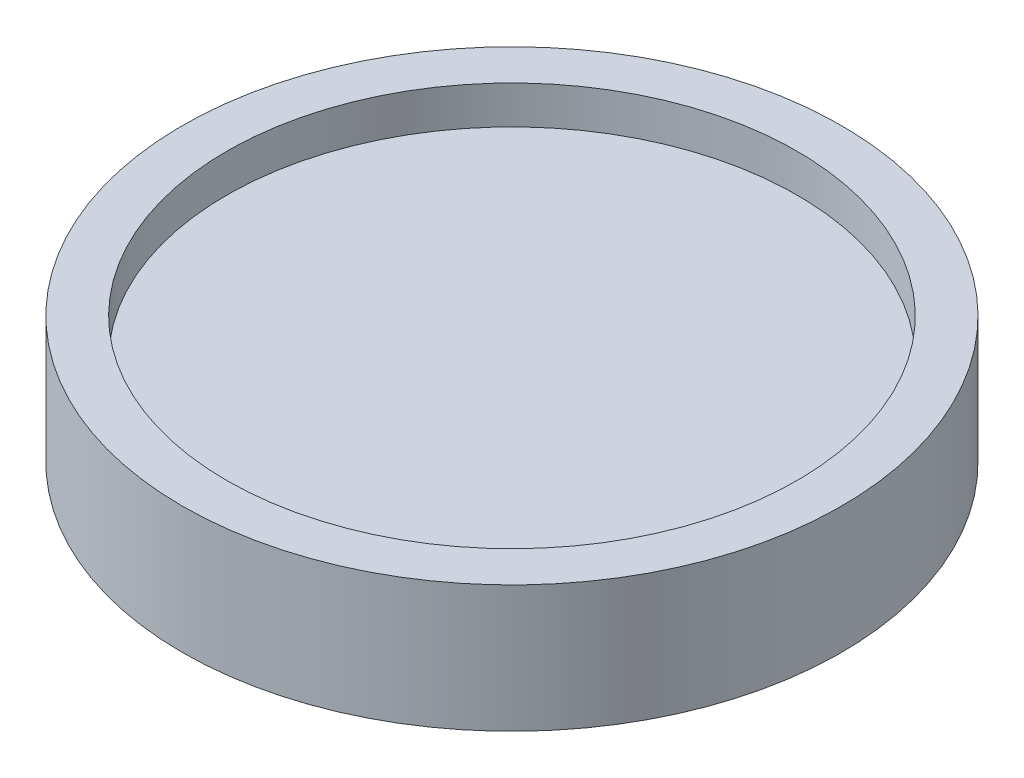
ISO-10303-21;
HEADER;
FILE_DESCRIPTION(('STEP AP214'),'2;1');
FILE_NAME('part.step','',(''),(''),'','','');
FILE_SCHEMA(('AUTOMOTIVE_DESIGN { 1 0 10303 214 1 1 1 1 }'));
ENDSEC;
DATA;
#1=APPLICATION_CONTEXT('core data for automotive mechanical design processes');
#2=APPLICATION_PROTOCOL_DEFINITION('international standard','automotive_design',2000,#1);
#3=PRODUCT_CONTEXT('',#1,'mechanical');
#4=PRODUCT('Part','Part','',(#3));
#5=PRODUCT_RELATED_PRODUCT_CATEGORY('part','',(#4));
#6=PRODUCT_DEFINITION_FORMATION('','',#4);
#7=PRODUCT_DEFINITION_CONTEXT('part definition',#1,'design');
#8=PRODUCT_DEFINITION('design','',#6,#7);
#9=PRODUCT_DEFINITION_SHAPE('','',#8);
#10=(LENGTH_UNIT() NAMED_UNIT(*) SI_UNIT(.MILLI.,.METRE.));
#11=(NAMED_UNIT(*) PLANE_ANGLE_UNIT() SI_UNIT($,.RADIAN.));
#12=(NAMED_UNIT(*) SI_UNIT($,.STERADIAN.) SOLID_ANGLE_UNIT());
#13=UNCERTAINTY_MEASURE_WITH_UNIT(LENGTH_MEASURE(1.E-05),#10,'distance_accuracy_value','');
#14=(GEOMETRIC_REPRESENTATION_CONTEXT(3) GLOBAL_UNCERTAINTY_ASSIGNED_CONTEXT((#13)) GLOBAL_UNIT_ASSIGNED_CONTEXT((#10,
#11,#12)) REPRESENTATION_CONTEXT('',''));
#15=CARTESIAN_POINT('',(0.,0.,0.));
#16=DIRECTION('',(0.,0.,1.));
#17=DIRECTION('',(1.,0.,0.));
#18=AXIS2_PLACEMENT_3D('',#15,#16,#17);
#19=CARTESIAN_POINT('',(0.,12.7,0.));
#20=DIRECTION('',(0.,-1.,0.));
#21=DIRECTION('',(0.,0.,-1.));
#22=AXIS2_PLACEMENT_3D('',#19,#20,#21);
#23=CYLINDRICAL_SURFACE('',#22,33.02);
#24=CARTESIAN_POINT('',(0.,12.7,0.));
#25=DIRECTION('',(0.,1.,0.));
#26=DIRECTION('',(0.,0.,1.));
#27=AXIS2_PLACEMENT_3D('',#24,#25,#26);
#28=CIRCLE('',#27,33.02);
#29=CARTESIAN_POINT('',(0.,12.7,33.02));
#30=VERTEX_POINT('',#29);
#31=EDGE_CURVE('E10',#30,#30,#28,.T.);
#32=ORIENTED_EDGE('',*,*,#31,.F.);
#33=EDGE_LOOP('',(#32));
#34=FACE_BOUND('',#33,.T.);
#35=CARTESIAN_POINT('',(0.,0.,0.));
#36=DIRECTION('',(0.,1.,0.));
#37=DIRECTION('',(0.,0.,1.));
#38=AXIS2_PLACEMENT_3D('',#35,#36,#37);
#39=CIRCLE('',#38,33.02);
#40=CARTESIAN_POINT('',(0.,0.,33.02));
#41=VERTEX_POINT('',#40);
#42=EDGE_CURVE('E40',#41,#41,#39,.T.);
#43=ORIENTED_EDGE('',*,*,#42,.T.);
#44=EDGE_LOOP('',(#43));
#45=FACE_BOUND('',#44,.T.);
#46=ADVANCED_FACE('F37',(#34,#45),#23,.T.);
#47=CARTESIAN_POINT('',(0.,12.7,0.));
#48=DIRECTION('',(0.,1.,0.));
#49=DIRECTION('',(0.,0.,1.));
#50=AXIS2_PLACEMENT_3D('',#47,#48,#49);
#51=PLANE('',#50);
#52=CARTESIAN_POINT('',(0.,12.7,0.));
#53=DIRECTION('',(0.,1.,0.));
#54=DIRECTION('',(0.,0.,1.));
#55=AXIS2_PLACEMENT_3D('',#52,#53,#54);
#56=CIRCLE('',#55,28.575);
#57=CARTESIAN_POINT('',(0.,12.7,28.575));
#58=VERTEX_POINT('',#57);
#59=EDGE_CURVE('E51',#58,#58,#56,.T.);
#60=ORIENTED_EDGE('',*,*,#59,.F.);
#61=EDGE_LOOP('',(#60));
#62=FACE_BOUND('',#61,.T.);
#63=ORIENTED_EDGE('',*,*,#31,.T.);
#64=EDGE_LOOP('',(#63));
#65=FACE_BOUND('',#64,.T.);
#66=ADVANCED_FACE('F68',(#62,#65),#51,.T.);
#67=CARTESIAN_POINT('',(0.,0.,0.));
#68=DIRECTION('',(0.,1.,0.));
#69=DIRECTION('',(0.,0.,1.));
#70=AXIS2_PLACEMENT_3D('',#67,#68,#69);
#71=PLANE('',#70);
#72=ORIENTED_EDGE('',*,*,#42,.F.);
#73=EDGE_LOOP('',(#72));
#74=FACE_BOUND('',#73,.T.);
#75=ADVANCED_FACE('F64',(#74),#71,.F.);
#76=CARTESIAN_POINT('',(0.,8.89,0.));
#77=DIRECTION('',(0.,1.,0.));
#78=DIRECTION('',(0.,0.,1.));
#79=AXIS2_PLACEMENT_3D('',#76,#77,#78);
#80=CYLINDRICAL_SURFACE('',#79,28.575);
#81=CARTESIAN_POINT('',(0.,8.89,0.));
#82=DIRECTION('',(0.,1.,0.));
#83=DIRECTION('',(0.,0.,1.));
#84=AXIS2_PLACEMENT_3D('',#81,#82,#83);
#85=CIRCLE('',#84,28.575);
#86=CARTESIAN_POINT('',(0.,8.89,28.575));
#87=VERTEX_POINT('',#86);
#88=EDGE_CURVE('E49',#87,#87,#85,.T.);
#89=CARTESIAN_POINT('',(0.,8.89,28.575));
#90=CARTESIAN_POINT('',(0.,8.9296875,28.575));
#91=CARTESIAN_POINT('',(0.,8.969375,28.575));
#92=CARTESIAN_POINT('',(0.,9.04875,28.575));
#93=CARTESIAN_POINT('',(0.,9.0884375,28.575));
#94=CARTESIAN_POINT('',(0.,9.1678125,28.575));
#95=CARTESIAN_POINT('',(0.,9.2075,28.575));
#96=CARTESIAN_POINT('',(0.,9.286875,28.575));
#97=CARTESIAN_POINT('',(0.,9.3265625,28.575));
#98=CARTESIAN_POINT('',(0.,9.4059375,28.575));
#99=CARTESIAN_POINT('',(0.,9.445625,28.575));
#100=CARTESIAN_POINT('',(0.,9.525,28.575));
#101=CARTESIAN_POINT('',(0.,9.5646875,28.575));
#102=CARTESIAN_POINT('',(0.,9.6440625,28.575));
#103=CARTESIAN_POINT('',(0.,9.68375,28.575));
#104=CARTESIAN_POINT('',(0.,9.763125,28.575));
#105=CARTESIAN_POINT('',(0.,9.8028125,28.575));
#106=CARTESIAN_POINT('',(0.,9.8821875,28.575));
#107=CARTESIAN_POINT('',(0.,9.921875,28.575));
#108=CARTESIAN_POINT('',(0.,10.00125,28.575));
#109=CARTESIAN_POINT('',(0.,10.0409375,28.575));
#110=CARTESIAN_POINT('',(0.,10.1203125,28.575));
#111=CARTESIAN_POINT('',(0.,10.16,28.575));
#112=CARTESIAN_POINT('',(0.,10.239375,28.575));
#113=CARTESIAN_POINT('',(0.,10.2790625,28.575));
#114=CARTESIAN_POINT('',(0.,10.3584375,28.575));
#115=CARTESIAN_POINT('',(0.,10.398125,28.575));
#116=CARTESIAN_POINT('',(0.,10.4775,28.575));
#117=CARTESIAN_POINT('',(0.,10.5171875,28.575));
#118=CARTESIAN_POINT('',(0.,10.5965625,28.575));
#119=CARTESIAN_POINT('',(0.,10.63625,28.575));
#120=CARTESIAN_POINT('',(0.,10.715625,28.575));
#121=CARTESIAN_POINT('',(0.,10.7553125,28.575));
#122=CARTESIAN_POINT('',(0.,10.8346875,28.575));
#123=CARTESIAN_POINT('',(0.,10.874375,28.575));
#124=CARTESIAN_POINT('',(0.,10.95375,28.575));
#125=CARTESIAN_POINT('',(0.,10.9934375,28.575));
#126=CARTESIAN_POINT('',(0.,11.0728125,28.575));
#127=CARTESIAN_POINT('',(0.,11.1125,28.575));
#128=CARTESIAN_POINT('',(0.,11.191875,28.575));
#129=CARTESIAN_POINT('',(0.,11.2315625,28.575));
#130=CARTESIAN_POINT('',(0.,11.3109375,28.575));
#131=CARTESIAN_POINT('',(0.,11.350625,28.575));
#132=CARTESIAN_POINT('',(0.,11.43,28.575));
#133=CARTESIAN_POINT('',(0.,11.4696875,28.575));
#134=CARTESIAN_POINT('',(0.,11.5490625,28.575));
#135=CARTESIAN_POINT('',(0.,11.58875,28.575));
#136=CARTESIAN_POINT('',(0.,11.668125,28.575));
#137=CARTESIAN_POINT('',(0.,11.7078125,28.575));
#138=CARTESIAN_POINT('',(0.,11.7871875,28.575));
#139=CARTESIAN_POINT('',(0.,11.826875,28.575));
#140=CARTESIAN_POINT('',(0.,11.90625,28.575));
#141=CARTESIAN_POINT('',(0.,11.9459375,28.575));
#142=CARTESIAN_POINT('',(0.,12.0253125,28.575));
#143=CARTESIAN_POINT('',(0.,12.065,28.575));
#144=CARTESIAN_POINT('',(0.,12.144375,28.575));
#145=CARTESIAN_POINT('',(0.,12.1840625,28.575));
#146=CARTESIAN_POINT('',(0.,12.2634375,28.575));
#147=CARTESIAN_POINT('',(0.,12.303125,28.575));
#148=CARTESIAN_POINT('',(0.,12.3825,28.575));
#149=CARTESIAN_POINT('',(0.,12.4221875,28.575));
#150=CARTESIAN_POINT('',(0.,12.5015625,28.575));
#151=CARTESIAN_POINT('',(0.,12.54125,28.575));
#152=CARTESIAN_POINT('',(0.,12.620625,28.575));
#153=CARTESIAN_POINT('',(0.,12.6603125,28.575));
#154=CARTESIAN_POINT('',(0.,12.7,28.575));
#155=B_SPLINE_CURVE_WITH_KNOTS('',3,(#89,#90,#91,#92,#93,#94,#95,#96,#97,#98,#99,#100,#101,#102,
#103,#104,#105,#106,#107,#108,#109,#110,#111,#112,#113,#114,#115,#116,#117,#118,#119,#120,#121,
#122,#123,#124,#125,#126,#127,#128,#129,#130,#131,#132,#133,#134,#135,#136,#137,#138,#139,#140,
#141,#142,#143,#144,#145,#146,#147,#148,#149,#150,#151,#152,#153,#154),.UNSPECIFIED.,.F.,.F.,(4,
2,2,2,2,2,2,2,2,2,2,2,2,2,2,2,2,2,2,2,2,2,2,2,2,2,2,2,2,2,2,2,4),(0.,0.119062500000001,0.238125,
0.357187500000002,0.476250000000001,0.5953125,0.714375,0.833437500000001,0.9525,1.0715625,
1.190625,1.3096875,1.42875,1.5478125,1.666875,1.7859375,1.905,2.0240625,2.143125,2.2621875,
2.38125,2.5003125,2.619375,2.7384375,2.8575,2.9765625,3.095625,3.2146875,3.33375,3.4528125,
3.571875,3.6909375,3.81),.UNSPECIFIED.);
#156=EDGE_CURVE('BSEAM61',#87,#58,#155,.T.);
#157=ORIENTED_EDGE('',*,*,#88,.F.);
#158=ORIENTED_EDGE('',*,*,#59,.T.);
#159=ORIENTED_EDGE('',*,*,#156,.T.);
#160=ORIENTED_EDGE('',*,*,#156,.F.);
#161=EDGE_LOOP('',(#157,#159,#158,#160));
#162=FACE_BOUND('',#161,.T.);
#163=ADVANCED_FACE('F61',(#162),#80,.F.);
#164=CARTESIAN_POINT('',(0.,8.89,0.));
#165=DIRECTION('',(0.,1.,0.));
#166=DIRECTION('',(0.,0.,1.));
#167=AXIS2_PLACEMENT_3D('',#164,#165,#166);
#168=PLANE('',#167);
#169=ORIENTED_EDGE('',*,*,#88,.T.);
#170=EDGE_LOOP('',(#169));
#171=FACE_BOUND('',#170,.T.);
#172=ADVANCED_FACE('F59',(#171),#168,.T.);
#173=CLOSED_SHELL('',(#46,#66,#75,#163,#172));
#174=MANIFOLD_SOLID_BREP('B2',#173);
#175=ADVANCED_BREP_SHAPE_REPRESENTATION('',(#18,#174),#14);
#176=SHAPE_DEFINITION_REPRESENTATION(#9,#175);
ENDSEC;
END-ISO-10303-21;
